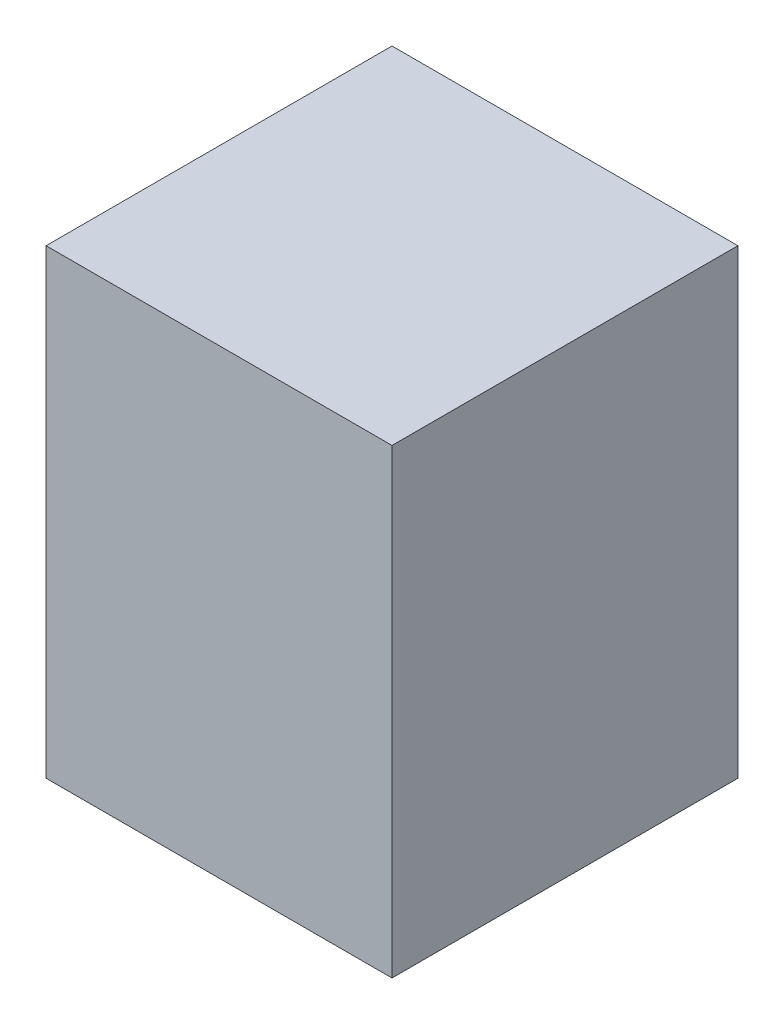
ISO-10303-21;
HEADER;
FILE_DESCRIPTION(('STEP AP214'),'2;1');
FILE_NAME('part.step','',(''),(''),'','','');
FILE_SCHEMA(('AUTOMOTIVE_DESIGN { 1 0 10303 214 1 1 1 1 }'));
ENDSEC;
DATA;
#1=APPLICATION_CONTEXT('core data for automotive mechanical design processes');
#2=APPLICATION_PROTOCOL_DEFINITION('international standard','automotive_design',2000,#1);
#3=PRODUCT_CONTEXT('',#1,'mechanical');
#4=PRODUCT('Part','Part','',(#3));
#5=PRODUCT_RELATED_PRODUCT_CATEGORY('part','',(#4));
#6=PRODUCT_DEFINITION_FORMATION('','',#4);
#7=PRODUCT_DEFINITION_CONTEXT('part definition',#1,'design');
#8=PRODUCT_DEFINITION('design','',#6,#7);
#9=PRODUCT_DEFINITION_SHAPE('','',#8);
#10=(LENGTH_UNIT() NAMED_UNIT(*) SI_UNIT(.MILLI.,.METRE.));
#11=(NAMED_UNIT(*) PLANE_ANGLE_UNIT() SI_UNIT($,.RADIAN.));
#12=(NAMED_UNIT(*) SI_UNIT($,.STERADIAN.) SOLID_ANGLE_UNIT());
#13=UNCERTAINTY_MEASURE_WITH_UNIT(LENGTH_MEASURE(1.E-05),#10,'distance_accuracy_value','');
#14=(GEOMETRIC_REPRESENTATION_CONTEXT(3) GLOBAL_UNCERTAINTY_ASSIGNED_CONTEXT((#13)) GLOBAL_UNIT_ASSIGNED_CONTEXT((#10,
#11,#12)) REPRESENTATION_CONTEXT('',''));
#15=CARTESIAN_POINT('',(0.,0.,0.));
#16=DIRECTION('',(0.,0.,1.));
#17=DIRECTION('',(1.,0.,0.));
#18=AXIS2_PLACEMENT_3D('',#15,#16,#17);
#19=CARTESIAN_POINT('',(15.,40.,15.));
#20=DIRECTION('',(-1.,0.,0.));
#21=DIRECTION('',(0.,0.,1.));
#22=AXIS2_PLACEMENT_3D('',#19,#20,#21);
#23=PLANE('',#22);
#24=DIRECTION('',(0.,0.,-1.));
#25=VECTOR('',#24,1.);
#26=CARTESIAN_POINT('',(15.,0.,15.));
#27=LINE('',#26,#25);
#28=CARTESIAN_POINT('',(15.,0.,15.));
#29=VERTEX_POINT('',#28);
#30=CARTESIAN_POINT('',(15.,0.,-15.));
#31=VERTEX_POINT('',#30);
#32=EDGE_CURVE('E104',#29,#31,#27,.T.);
#33=ORIENTED_EDGE('',*,*,#32,.T.);
#34=DIRECTION('',(0.,-1.,0.));
#35=VECTOR('',#34,1.);
#36=CARTESIAN_POINT('',(15.,40.,-15.));
#37=LINE('',#36,#35);
#38=CARTESIAN_POINT('',(15.,40.,-15.));
#39=VERTEX_POINT('',#38);
#40=EDGE_CURVE('E11',#39,#31,#37,.T.);
#41=ORIENTED_EDGE('',*,*,#40,.F.);
#42=DIRECTION('',(0.,0.,-1.));
#43=VECTOR('',#42,1.);
#44=CARTESIAN_POINT('',(15.,40.,15.));
#45=LINE('',#44,#43);
#46=CARTESIAN_POINT('',(15.,40.,15.));
#47=VERTEX_POINT('',#46);
#48=EDGE_CURVE('E92',#47,#39,#45,.T.);
#49=ORIENTED_EDGE('',*,*,#48,.F.);
#50=DIRECTION('',(0.,-1.,0.));
#51=VECTOR('',#50,1.);
#52=CARTESIAN_POINT('',(15.,40.,15.));
#53=LINE('',#52,#51);
#54=EDGE_CURVE('E100',#47,#29,#53,.T.);
#55=ORIENTED_EDGE('',*,*,#54,.T.);
#56=EDGE_LOOP('',(#33,#41,#49,#55));
#57=FACE_BOUND('',#56,.T.);
#58=ADVANCED_FACE('F41',(#57),#23,.F.);
#59=CARTESIAN_POINT('',(-15.,40.,-15.));
#60=DIRECTION('',(0.,0.,1.));
#61=DIRECTION('',(1.,0.,0.));
#62=AXIS2_PLACEMENT_3D('',#59,#60,#61);
#63=PLANE('',#62);
#64=DIRECTION('',(-1.,0.,0.));
#65=VECTOR('',#64,1.);
#66=CARTESIAN_POINT('',(-15.,0.,-15.));
#67=LINE('',#66,#65);
#68=CARTESIAN_POINT('',(-15.,0.,-15.));
#69=VERTEX_POINT('',#68);
#70=EDGE_CURVE('E96',#31,#69,#67,.T.);
#71=ORIENTED_EDGE('',*,*,#70,.T.);
#72=DIRECTION('',(0.,-1.,0.));
#73=VECTOR('',#72,1.);
#74=CARTESIAN_POINT('',(-15.,40.,-15.));
#75=LINE('',#74,#73);
#76=CARTESIAN_POINT('',(-15.,40.,-15.));
#77=VERTEX_POINT('',#76);
#78=EDGE_CURVE('E49',#77,#69,#75,.T.);
#79=ORIENTED_EDGE('',*,*,#78,.F.);
#80=DIRECTION('',(-1.,0.,0.));
#81=VECTOR('',#80,1.);
#82=CARTESIAN_POINT('',(-15.,40.,-15.));
#83=LINE('',#82,#81);
#84=EDGE_CURVE('E87',#39,#77,#83,.T.);
#85=ORIENTED_EDGE('',*,*,#84,.F.);
#86=ORIENTED_EDGE('',*,*,#40,.T.);
#87=EDGE_LOOP('',(#71,#79,#85,#86));
#88=FACE_BOUND('',#87,.T.);
#89=ADVANCED_FACE('F95',(#88),#63,.F.);
#90=CARTESIAN_POINT('',(-15.,40.,15.));
#91=DIRECTION('',(1.,0.,0.));
#92=DIRECTION('',(0.,0.,-1.));
#93=AXIS2_PLACEMENT_3D('',#90,#91,#92);
#94=PLANE('',#93);
#95=DIRECTION('',(0.,0.,1.));
#96=VECTOR('',#95,1.);
#97=CARTESIAN_POINT('',(-15.,0.,15.));
#98=LINE('',#97,#96);
#99=CARTESIAN_POINT('',(-15.,0.,15.));
#100=VERTEX_POINT('',#99);
#101=EDGE_CURVE('E74',#69,#100,#98,.T.);
#102=ORIENTED_EDGE('',*,*,#101,.T.);
#103=DIRECTION('',(0.,-1.,0.));
#104=VECTOR('',#103,1.);
#105=CARTESIAN_POINT('',(-15.,40.,15.));
#106=LINE('',#105,#104);
#107=CARTESIAN_POINT('',(-15.,40.,15.));
#108=VERTEX_POINT('',#107);
#109=EDGE_CURVE('E97',#108,#100,#106,.T.);
#110=ORIENTED_EDGE('',*,*,#109,.F.);
#111=DIRECTION('',(0.,0.,1.));
#112=VECTOR('',#111,1.);
#113=CARTESIAN_POINT('',(-15.,40.,15.));
#114=LINE('',#113,#112);
#115=EDGE_CURVE('E90',#77,#108,#114,.T.);
#116=ORIENTED_EDGE('',*,*,#115,.F.);
#117=ORIENTED_EDGE('',*,*,#78,.T.);
#118=EDGE_LOOP('',(#102,#110,#116,#117));
#119=FACE_BOUND('',#118,.T.);
#120=ADVANCED_FACE('F98',(#119),#94,.F.);
#121=CARTESIAN_POINT('',(-15.,40.,15.));
#122=DIRECTION('',(0.,0.,-1.));
#123=DIRECTION('',(-1.,0.,0.));
#124=AXIS2_PLACEMENT_3D('',#121,#122,#123);
#125=PLANE('',#124);
#126=DIRECTION('',(1.,0.,0.));
#127=VECTOR('',#126,1.);
#128=CARTESIAN_POINT('',(-15.,0.,15.));
#129=LINE('',#128,#127);
#130=EDGE_CURVE('E80',#100,#29,#129,.T.);
#131=ORIENTED_EDGE('',*,*,#130,.T.);
#132=ORIENTED_EDGE('',*,*,#54,.F.);
#133=DIRECTION('',(1.,0.,0.));
#134=VECTOR('',#133,1.);
#135=CARTESIAN_POINT('',(-15.,40.,15.));
#136=LINE('',#135,#134);
#137=EDGE_CURVE('E57',#108,#47,#136,.T.);
#138=ORIENTED_EDGE('',*,*,#137,.F.);
#139=ORIENTED_EDGE('',*,*,#109,.T.);
#140=EDGE_LOOP('',(#131,#132,#138,#139));
#141=FACE_BOUND('',#140,.T.);
#142=ADVANCED_FACE('F112',(#141),#125,.F.);
#143=CARTESIAN_POINT('',(0.,40.,0.));
#144=DIRECTION('',(0.,-1.,0.));
#145=DIRECTION('',(0.,0.,-1.));
#146=AXIS2_PLACEMENT_3D('',#143,#144,#145);
#147=PLANE('',#146);
#148=ORIENTED_EDGE('',*,*,#48,.T.);
#149=ORIENTED_EDGE('',*,*,#84,.T.);
#150=ORIENTED_EDGE('',*,*,#115,.T.);
#151=ORIENTED_EDGE('',*,*,#137,.T.);
#152=EDGE_LOOP('',(#148,#149,#150,#151));
#153=FACE_BOUND('',#152,.T.);
#154=ADVANCED_FACE('F88',(#153),#147,.F.);
#155=CARTESIAN_POINT('',(0.,0.,0.));
#156=DIRECTION('',(0.,-1.,0.));
#157=DIRECTION('',(0.,0.,-1.));
#158=AXIS2_PLACEMENT_3D('',#155,#156,#157);
#159=PLANE('',#158);
#160=CARTESIAN_POINT('',(0.,0.,10.5));
#161=DIRECTION('',(0.,-1.,0.));
#162=DIRECTION('',(0.,0.,-1.));
#163=AXIS2_PLACEMENT_3D('',#160,#161,#162);
#164=CIRCLE('',#163,1.5);
#165=CARTESIAN_POINT('',(0.,0.,9.));
#166=VERTEX_POINT('',#165);
#167=EDGE_CURVE('E136',#166,#166,#164,.T.);
#168=ORIENTED_EDGE('',*,*,#167,.F.);
#169=EDGE_LOOP('',(#168));
#170=FACE_BOUND('',#169,.T.);
#171=CARTESIAN_POINT('',(10.5,0.,0.));
#172=DIRECTION('',(0.,-1.,0.));
#173=DIRECTION('',(0.,0.,-1.));
#174=AXIS2_PLACEMENT_3D('',#171,#172,#173);
#175=CIRCLE('',#174,1.5);
#176=CARTESIAN_POINT('',(10.5,0.,-1.5));
#177=VERTEX_POINT('',#176);
#178=EDGE_CURVE('E133',#177,#177,#175,.T.);
#179=ORIENTED_EDGE('',*,*,#178,.F.);
#180=EDGE_LOOP('',(#179));
#181=FACE_BOUND('',#180,.T.);
#182=CARTESIAN_POINT('',(0.,0.,-10.5));
#183=DIRECTION('',(0.,-1.,0.));
#184=DIRECTION('',(0.,0.,-1.));
#185=AXIS2_PLACEMENT_3D('',#182,#183,#184);
#186=CIRCLE('',#185,1.5);
#187=CARTESIAN_POINT('',(0.,0.,-12.));
#188=VERTEX_POINT('',#187);
#189=EDGE_CURVE('E127',#188,#188,#186,.T.);
#190=ORIENTED_EDGE('',*,*,#189,.F.);
#191=EDGE_LOOP('',(#190));
#192=FACE_BOUND('',#191,.T.);
#193=CARTESIAN_POINT('',(-10.5,0.,0.));
#194=DIRECTION('',(0.,-1.,0.));
#195=DIRECTION('',(0.,0.,-1.));
#196=AXIS2_PLACEMENT_3D('',#193,#194,#195);
#197=CIRCLE('',#196,1.5);
#198=CARTESIAN_POINT('',(-10.5,0.,-1.5));
#199=VERTEX_POINT('',#198);
#200=EDGE_CURVE('E121',#199,#199,#197,.T.);
#201=ORIENTED_EDGE('',*,*,#200,.F.);
#202=EDGE_LOOP('',(#201));
#203=FACE_BOUND('',#202,.T.);
#204=ORIENTED_EDGE('',*,*,#32,.F.);
#205=ORIENTED_EDGE('',*,*,#130,.F.);
#206=ORIENTED_EDGE('',*,*,#101,.F.);
#207=ORIENTED_EDGE('',*,*,#70,.F.);
#208=EDGE_LOOP('',(#204,#205,#206,#207));
#209=FACE_BOUND('',#208,.T.);
#210=ADVANCED_FACE('F115',(#170,#181,#192,#203,#209),#159,.T.);
#211=CARTESIAN_POINT('',(-10.5,17.,0.));
#212=DIRECTION('',(0.,-1.,0.));
#213=DIRECTION('',(0.,0.,-1.));
#214=AXIS2_PLACEMENT_3D('',#211,#212,#213);
#215=CYLINDRICAL_SURFACE('',#214,1.5);
#216=CARTESIAN_POINT('',(-10.5,17.,0.));
#217=DIRECTION('',(0.,-1.,0.));
#218=DIRECTION('',(0.,0.,-1.));
#219=AXIS2_PLACEMENT_3D('',#216,#217,#218);
#220=CIRCLE('',#219,1.5);
#221=CARTESIAN_POINT('',(-10.5,17.,-1.5));
#222=VERTEX_POINT('',#221);
#223=EDGE_CURVE('E118',#222,#222,#220,.T.);
#224=ORIENTED_EDGE('',*,*,#223,.F.);
#225=EDGE_LOOP('',(#224));
#226=FACE_BOUND('',#225,.T.);
#227=ORIENTED_EDGE('',*,*,#200,.T.);
#228=EDGE_LOOP('',(#227));
#229=FACE_BOUND('',#228,.T.);
#230=ADVANCED_FACE('F153',(#226,#229),#215,.F.);
#231=CARTESIAN_POINT('',(-10.5,17.,0.));
#232=DIRECTION('',(0.,-1.,0.));
#233=DIRECTION('',(0.,0.,-1.));
#234=AXIS2_PLACEMENT_3D('',#231,#232,#233);
#235=PLANE('',#234);
#236=ORIENTED_EDGE('',*,*,#223,.T.);
#237=EDGE_LOOP('',(#236));
#238=FACE_BOUND('',#237,.T.);
#239=ADVANCED_FACE('F162',(#238),#235,.T.);
#240=CARTESIAN_POINT('',(0.,17.,-10.5));
#241=DIRECTION('',(0.,-1.,0.));
#242=DIRECTION('',(0.,0.,-1.));
#243=AXIS2_PLACEMENT_3D('',#240,#241,#242);
#244=CYLINDRICAL_SURFACE('',#243,1.5);
#245=CARTESIAN_POINT('',(0.,17.,-10.5));
#246=DIRECTION('',(0.,-1.,0.));
#247=DIRECTION('',(0.,0.,-1.));
#248=AXIS2_PLACEMENT_3D('',#245,#246,#247);
#249=CIRCLE('',#248,1.5);
#250=CARTESIAN_POINT('',(0.,17.,-12.));
#251=VERTEX_POINT('',#250);
#252=EDGE_CURVE('E124',#251,#251,#249,.T.);
#253=ORIENTED_EDGE('',*,*,#252,.F.);
#254=EDGE_LOOP('',(#253));
#255=FACE_BOUND('',#254,.T.);
#256=ORIENTED_EDGE('',*,*,#189,.T.);
#257=EDGE_LOOP('',(#256));
#258=FACE_BOUND('',#257,.T.);
#259=ADVANCED_FACE('F168',(#255,#258),#244,.F.);
#260=CARTESIAN_POINT('',(0.,17.,-10.5));
#261=DIRECTION('',(0.,-1.,0.));
#262=DIRECTION('',(0.,0.,-1.));
#263=AXIS2_PLACEMENT_3D('',#260,#261,#262);
#264=PLANE('',#263);
#265=ORIENTED_EDGE('',*,*,#252,.T.);
#266=EDGE_LOOP('',(#265));
#267=FACE_BOUND('',#266,.T.);
#268=ADVANCED_FACE('F215',(#267),#264,.T.);
#269=CARTESIAN_POINT('',(10.5,17.,0.));
#270=DIRECTION('',(0.,-1.,0.));
#271=DIRECTION('',(0.,0.,-1.));
#272=AXIS2_PLACEMENT_3D('',#269,#270,#271);
#273=CYLINDRICAL_SURFACE('',#272,1.5);
#274=CARTESIAN_POINT('',(10.5,17.,0.));
#275=DIRECTION('',(0.,-1.,0.));
#276=DIRECTION('',(0.,0.,-1.));
#277=AXIS2_PLACEMENT_3D('',#274,#275,#276);
#278=CIRCLE('',#277,1.5);
#279=CARTESIAN_POINT('',(10.5,17.,-1.5));
#280=VERTEX_POINT('',#279);
#281=EDGE_CURVE('E130',#280,#280,#278,.T.);
#282=ORIENTED_EDGE('',*,*,#281,.F.);
#283=EDGE_LOOP('',(#282));
#284=FACE_BOUND('',#283,.T.);
#285=ORIENTED_EDGE('',*,*,#178,.T.);
#286=EDGE_LOOP('',(#285));
#287=FACE_BOUND('',#286,.T.);
#288=ADVANCED_FACE('F226',(#284,#287),#273,.F.);
#289=CARTESIAN_POINT('',(10.5,17.,0.));
#290=DIRECTION('',(0.,-1.,0.));
#291=DIRECTION('',(0.,0.,-1.));
#292=AXIS2_PLACEMENT_3D('',#289,#290,#291);
#293=PLANE('',#292);
#294=ORIENTED_EDGE('',*,*,#281,.T.);
#295=EDGE_LOOP('',(#294));
#296=FACE_BOUND('',#295,.T.);
#297=ADVANCED_FACE('F147',(#296),#293,.T.);
#298=CARTESIAN_POINT('',(0.,17.,10.5));
#299=DIRECTION('',(0.,-1.,0.));
#300=DIRECTION('',(0.,0.,-1.));
#301=AXIS2_PLACEMENT_3D('',#298,#299,#300);
#302=CYLINDRICAL_SURFACE('',#301,1.5);
#303=CARTESIAN_POINT('',(0.,17.,10.5));
#304=DIRECTION('',(0.,-1.,0.));
#305=DIRECTION('',(0.,0.,-1.));
#306=AXIS2_PLACEMENT_3D('',#303,#304,#305);
#307=CIRCLE('',#306,1.5);
#308=CARTESIAN_POINT('',(0.,17.,9.));
#309=VERTEX_POINT('',#308);
#310=EDGE_CURVE('E107',#309,#309,#307,.T.);
#311=ORIENTED_EDGE('',*,*,#310,.F.);
#312=EDGE_LOOP('',(#311));
#313=FACE_BOUND('',#312,.T.);
#314=ORIENTED_EDGE('',*,*,#167,.T.);
#315=EDGE_LOOP('',(#314));
#316=FACE_BOUND('',#315,.T.);
#317=ADVANCED_FACE('F144',(#313,#316),#302,.F.);
#318=CARTESIAN_POINT('',(0.,17.,10.5));
#319=DIRECTION('',(0.,-1.,0.));
#320=DIRECTION('',(0.,0.,-1.));
#321=AXIS2_PLACEMENT_3D('',#318,#319,#320);
#322=PLANE('',#321);
#323=ORIENTED_EDGE('',*,*,#310,.T.);
#324=EDGE_LOOP('',(#323));
#325=FACE_BOUND('',#324,.T.);
#326=ADVANCED_FACE('F142',(#325),#322,.T.);
#327=CLOSED_SHELL('',(#58,#89,#120,#142,#154,#210,#230,#239,#259,#268,#288,#297,#317,#326));
#328=MANIFOLD_SOLID_BREP('B2',#327);
#329=ADVANCED_BREP_SHAPE_REPRESENTATION('',(#18,#328),#14);
#330=SHAPE_DEFINITION_REPRESENTATION(#9,#329);
ENDSEC;
END-ISO-10303-21;
